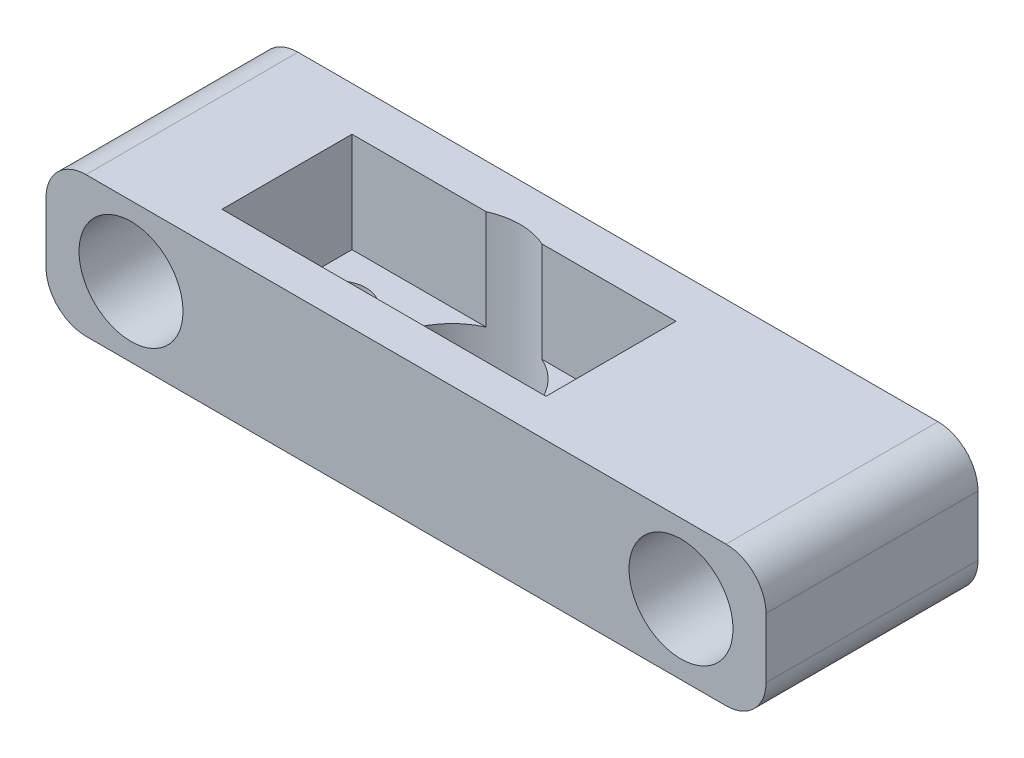
ISO-10303-21;
HEADER;
FILE_DESCRIPTION(('STEP AP214'),'2;1');
FILE_NAME('part.step','',(''),(''),'','','');
FILE_SCHEMA(('AUTOMOTIVE_DESIGN { 1 0 10303 214 1 1 1 1 }'));
ENDSEC;
DATA;
#1=APPLICATION_CONTEXT('core data for automotive mechanical design processes');
#2=APPLICATION_PROTOCOL_DEFINITION('international standard','automotive_design',2000,#1);
#3=PRODUCT_CONTEXT('',#1,'mechanical');
#4=PRODUCT('Part','Part','',(#3));
#5=PRODUCT_RELATED_PRODUCT_CATEGORY('part','',(#4));
#6=PRODUCT_DEFINITION_FORMATION('','',#4);
#7=PRODUCT_DEFINITION_CONTEXT('part definition',#1,'design');
#8=PRODUCT_DEFINITION('design','',#6,#7);
#9=PRODUCT_DEFINITION_SHAPE('','',#8);
#10=(LENGTH_UNIT() NAMED_UNIT(*) SI_UNIT(.MILLI.,.METRE.));
#11=(NAMED_UNIT(*) PLANE_ANGLE_UNIT() SI_UNIT($,.RADIAN.));
#12=(NAMED_UNIT(*) SI_UNIT($,.STERADIAN.) SOLID_ANGLE_UNIT());
#13=UNCERTAINTY_MEASURE_WITH_UNIT(LENGTH_MEASURE(1.E-05),#10,'distance_accuracy_value','');
#14=(GEOMETRIC_REPRESENTATION_CONTEXT(3) GLOBAL_UNCERTAINTY_ASSIGNED_CONTEXT((#13)) GLOBAL_UNIT_ASSIGNED_CONTEXT((#10,
#11,#12)) REPRESENTATION_CONTEXT('',''));
#15=CARTESIAN_POINT('',(0.,0.,0.));
#16=DIRECTION('',(0.,0.,1.));
#17=DIRECTION('',(1.,0.,0.));
#18=AXIS2_PLACEMENT_3D('',#15,#16,#17);
#19=CARTESIAN_POINT('',(0.,0.,10.6));
#20=DIRECTION('',(0.,0.,1.));
#21=DIRECTION('',(1.,0.,0.));
#22=AXIS2_PLACEMENT_3D('',#19,#20,#21);
#23=PLANE('',#22);
#24=CARTESIAN_POINT('',(-41.766694490818,12.3780487804878,10.6));
#25=DIRECTION('',(0.,0.,1.));
#26=DIRECTION('',(1.,0.,0.));
#27=AXIS2_PLACEMENT_3D('',#24,#25,#26);
#28=CIRCLE('',#27,2.6);
#29=CARTESIAN_POINT('',(-39.166694490818,12.3780487804878,10.6));
#30=VERTEX_POINT('',#29);
#31=EDGE_CURVE('E212',#30,#30,#28,.T.);
#32=ORIENTED_EDGE('',*,*,#31,.F.);
#33=EDGE_LOOP('',(#32));
#34=FACE_BOUND('',#33,.T.);
#35=DIRECTION('',(0.,1.,0.));
#36=VECTOR('',#35,1.);
#37=CARTESIAN_POINT('',(-10.016694490818,15.8780487804878,10.6));
#38=LINE('',#37,#36);
#39=CARTESIAN_POINT('',(-10.016694490818,10.8780487804878,10.6));
#40=VERTEX_POINT('',#39);
#41=CARTESIAN_POINT('',(-10.016694490818,13.8780487804878,10.6));
#42=VERTEX_POINT('',#41);
#43=EDGE_CURVE('E223',#40,#42,#38,.T.);
#44=ORIENTED_EDGE('',*,*,#43,.T.);
#45=CARTESIAN_POINT('',(-12.016694490818,13.8780487804878,10.6));
#46=DIRECTION('',(0.,0.,1.));
#47=DIRECTION('',(1.,0.,0.));
#48=AXIS2_PLACEMENT_3D('',#45,#46,#47);
#49=CIRCLE('',#48,2.);
#50=CARTESIAN_POINT('',(-12.016694490818,15.8780487804878,10.6));
#51=VERTEX_POINT('',#50);
#52=EDGE_CURVE('E261',#42,#51,#49,.T.);
#53=ORIENTED_EDGE('',*,*,#52,.T.);
#54=DIRECTION('',(-1.,0.,0.));
#55=VECTOR('',#54,1.);
#56=CARTESIAN_POINT('',(-46.016694490818,15.8780487804878,10.6));
#57=LINE('',#56,#55);
#58=CARTESIAN_POINT('',(-44.016694490818,15.8780487804878,10.6));
#59=VERTEX_POINT('',#58);
#60=EDGE_CURVE('E226',#51,#59,#57,.T.);
#61=ORIENTED_EDGE('',*,*,#60,.T.);
#62=CARTESIAN_POINT('',(-44.016694490818,13.8780487804878,10.6));
#63=DIRECTION('',(0.,0.,1.));
#64=DIRECTION('',(1.,0.,0.));
#65=AXIS2_PLACEMENT_3D('',#62,#63,#64);
#66=CIRCLE('',#65,2.);
#67=CARTESIAN_POINT('',(-46.016694490818,13.8780487804878,10.6));
#68=VERTEX_POINT('',#67);
#69=EDGE_CURVE('E256',#59,#68,#66,.T.);
#70=ORIENTED_EDGE('',*,*,#69,.T.);
#71=DIRECTION('',(0.,-1.,0.));
#72=VECTOR('',#71,1.);
#73=CARTESIAN_POINT('',(-46.016694490818,15.8780487804878,10.6));
#74=LINE('',#73,#72);
#75=CARTESIAN_POINT('',(-46.016694490818,10.8780487804878,10.6));
#76=VERTEX_POINT('',#75);
#77=EDGE_CURVE('E218',#68,#76,#74,.T.);
#78=ORIENTED_EDGE('',*,*,#77,.T.);
#79=CARTESIAN_POINT('',(-44.016694490818,10.8780487804878,10.6));
#80=DIRECTION('',(0.,0.,1.));
#81=DIRECTION('',(1.,0.,0.));
#82=AXIS2_PLACEMENT_3D('',#79,#80,#81);
#83=CIRCLE('',#82,2.);
#84=CARTESIAN_POINT('',(-44.016694490818,8.8780487804878,10.6));
#85=VERTEX_POINT('',#84);
#86=EDGE_CURVE('E55',#76,#85,#83,.T.);
#87=ORIENTED_EDGE('',*,*,#86,.T.);
#88=DIRECTION('',(1.,0.,0.));
#89=VECTOR('',#88,1.);
#90=CARTESIAN_POINT('',(-46.016694490818,8.8780487804878,10.6));
#91=LINE('',#90,#89);
#92=CARTESIAN_POINT('',(-12.016694490818,8.8780487804878,10.6));
#93=VERTEX_POINT('',#92);
#94=EDGE_CURVE('E220',#85,#93,#91,.T.);
#95=ORIENTED_EDGE('',*,*,#94,.T.);
#96=CARTESIAN_POINT('',(-12.016694490818,10.8780487804878,10.6));
#97=DIRECTION('',(0.,0.,1.));
#98=DIRECTION('',(1.,0.,0.));
#99=AXIS2_PLACEMENT_3D('',#96,#97,#98);
#100=CIRCLE('',#99,2.);
#101=EDGE_CURVE('E259',#93,#40,#100,.T.);
#102=ORIENTED_EDGE('',*,*,#101,.T.);
#103=EDGE_LOOP('',(#44,#53,#61,#70,#78,#87,#95,#102));
#104=FACE_BOUND('',#103,.T.);
#105=CARTESIAN_POINT('',(-14.266694490818,12.3780487804878,10.6));
#106=DIRECTION('',(0.,0.,1.));
#107=DIRECTION('',(1.,0.,0.));
#108=AXIS2_PLACEMENT_3D('',#105,#106,#107);
#109=CIRCLE('',#108,2.6);
#110=CARTESIAN_POINT('',(-11.666694490818,12.3780487804878,10.6));
#111=VERTEX_POINT('',#110);
#112=EDGE_CURVE('E206',#111,#111,#109,.T.);
#113=ORIENTED_EDGE('',*,*,#112,.F.);
#114=EDGE_LOOP('',(#113));
#115=FACE_BOUND('',#114,.T.);
#116=ADVANCED_FACE('F33',(#34,#104,#115),#23,.T.);
#117=CARTESIAN_POINT('',(0.,0.,0.));
#118=DIRECTION('',(0.,0.,1.));
#119=DIRECTION('',(1.,0.,0.));
#120=AXIS2_PLACEMENT_3D('',#117,#118,#119);
#121=PLANE('',#120);
#122=DIRECTION('',(-1.,0.,0.));
#123=VECTOR('',#122,1.);
#124=CARTESIAN_POINT('',(-46.016694490818,15.8780487804878,0.));
#125=LINE('',#124,#123);
#126=CARTESIAN_POINT('',(-12.016694490818,15.8780487804878,0.));
#127=VERTEX_POINT('',#126);
#128=CARTESIAN_POINT('',(-44.016694490818,15.8780487804878,0.));
#129=VERTEX_POINT('',#128);
#130=EDGE_CURVE('E221',#127,#129,#125,.T.);
#131=ORIENTED_EDGE('',*,*,#130,.F.);
#132=CARTESIAN_POINT('',(-12.016694490818,13.8780487804878,0.));
#133=DIRECTION('',(0.,0.,1.));
#134=DIRECTION('',(1.,0.,0.));
#135=AXIS2_PLACEMENT_3D('',#132,#133,#134);
#136=CIRCLE('',#135,2.);
#137=CARTESIAN_POINT('',(-10.016694490818,13.8780487804878,0.));
#138=VERTEX_POINT('',#137);
#139=EDGE_CURVE('E249',#127,#138,#136,.F.);
#140=ORIENTED_EDGE('',*,*,#139,.T.);
#141=DIRECTION('',(0.,1.,0.));
#142=VECTOR('',#141,1.);
#143=CARTESIAN_POINT('',(-10.016694490818,15.8780487804878,0.));
#144=LINE('',#143,#142);
#145=CARTESIAN_POINT('',(-10.016694490818,10.8780487804878,0.));
#146=VERTEX_POINT('',#145);
#147=EDGE_CURVE('E234',#146,#138,#144,.T.);
#148=ORIENTED_EDGE('',*,*,#147,.F.);
#149=CARTESIAN_POINT('',(-12.016694490818,10.8780487804878,0.));
#150=DIRECTION('',(0.,0.,1.));
#151=DIRECTION('',(1.,0.,0.));
#152=AXIS2_PLACEMENT_3D('',#149,#150,#151);
#153=CIRCLE('',#152,2.);
#154=CARTESIAN_POINT('',(-12.016694490818,8.8780487804878,0.));
#155=VERTEX_POINT('',#154);
#156=EDGE_CURVE('E247',#146,#155,#153,.F.);
#157=ORIENTED_EDGE('',*,*,#156,.T.);
#158=DIRECTION('',(1.,0.,0.));
#159=VECTOR('',#158,1.);
#160=CARTESIAN_POINT('',(-46.016694490818,8.8780487804878,0.));
#161=LINE('',#160,#159);
#162=CARTESIAN_POINT('',(-44.016694490818,8.8780487804878,0.));
#163=VERTEX_POINT('',#162);
#164=EDGE_CURVE('E232',#163,#155,#161,.T.);
#165=ORIENTED_EDGE('',*,*,#164,.F.);
#166=CARTESIAN_POINT('',(-44.016694490818,10.8780487804878,0.));
#167=DIRECTION('',(0.,0.,1.));
#168=DIRECTION('',(1.,0.,0.));
#169=AXIS2_PLACEMENT_3D('',#166,#167,#168);
#170=CIRCLE('',#169,2.);
#171=CARTESIAN_POINT('',(-46.016694490818,10.8780487804878,0.));
#172=VERTEX_POINT('',#171);
#173=EDGE_CURVE('E245',#163,#172,#170,.F.);
#174=ORIENTED_EDGE('',*,*,#173,.T.);
#175=DIRECTION('',(0.,-1.,0.));
#176=VECTOR('',#175,1.);
#177=CARTESIAN_POINT('',(-46.016694490818,15.8780487804878,0.));
#178=LINE('',#177,#176);
#179=CARTESIAN_POINT('',(-46.016694490818,13.8780487804878,0.));
#180=VERTEX_POINT('',#179);
#181=EDGE_CURVE('E215',#180,#172,#178,.T.);
#182=ORIENTED_EDGE('',*,*,#181,.F.);
#183=CARTESIAN_POINT('',(-44.016694490818,13.8780487804878,0.));
#184=DIRECTION('',(0.,0.,1.));
#185=DIRECTION('',(1.,0.,0.));
#186=AXIS2_PLACEMENT_3D('',#183,#184,#185);
#187=CIRCLE('',#186,2.);
#188=EDGE_CURVE('E243',#180,#129,#187,.F.);
#189=ORIENTED_EDGE('',*,*,#188,.T.);
#190=EDGE_LOOP('',(#131,#140,#148,#157,#165,#174,#182,#189));
#191=FACE_BOUND('',#190,.T.);
#192=CARTESIAN_POINT('',(-41.766694490818,12.3780487804878,0.));
#193=DIRECTION('',(0.,0.,1.));
#194=DIRECTION('',(1.,0.,0.));
#195=AXIS2_PLACEMENT_3D('',#192,#193,#194);
#196=CIRCLE('',#195,2.6);
#197=CARTESIAN_POINT('',(-39.166694490818,12.3780487804878,0.));
#198=VERTEX_POINT('',#197);
#199=EDGE_CURVE('E209',#198,#198,#196,.T.);
#200=ORIENTED_EDGE('',*,*,#199,.T.);
#201=EDGE_LOOP('',(#200));
#202=FACE_BOUND('',#201,.T.);
#203=CARTESIAN_POINT('',(-14.266694490818,12.3780487804878,0.));
#204=DIRECTION('',(0.,0.,1.));
#205=DIRECTION('',(1.,0.,0.));
#206=AXIS2_PLACEMENT_3D('',#203,#204,#205);
#207=CIRCLE('',#206,2.6);
#208=CARTESIAN_POINT('',(-11.666694490818,12.3780487804878,0.));
#209=VERTEX_POINT('',#208);
#210=EDGE_CURVE('E203',#209,#209,#207,.T.);
#211=ORIENTED_EDGE('',*,*,#210,.T.);
#212=EDGE_LOOP('',(#211));
#213=FACE_BOUND('',#212,.T.);
#214=ADVANCED_FACE('F310',(#191,#202,#213),#121,.F.);
#215=CARTESIAN_POINT('',(-46.016694490818,15.8780487804878,10.6));
#216=DIRECTION('',(1.,0.,0.));
#217=DIRECTION('',(0.,0.,-1.));
#218=AXIS2_PLACEMENT_3D('',#215,#216,#217);
#219=PLANE('',#218);
#220=ORIENTED_EDGE('',*,*,#181,.T.);
#221=DIRECTION('',(0.,0.,-1.));
#222=VECTOR('',#221,1.);
#223=CARTESIAN_POINT('',(-46.016694490818,10.8780487804878,10.6));
#224=LINE('',#223,#222);
#225=EDGE_CURVE('E270',#172,#76,#224,.F.);
#226=ORIENTED_EDGE('',*,*,#225,.T.);
#227=ORIENTED_EDGE('',*,*,#77,.F.);
#228=DIRECTION('',(0.,0.,-1.));
#229=VECTOR('',#228,1.);
#230=CARTESIAN_POINT('',(-46.016694490818,13.8780487804878,10.6));
#231=LINE('',#230,#229);
#232=EDGE_CURVE('E267',#68,#180,#231,.T.);
#233=ORIENTED_EDGE('',*,*,#232,.T.);
#234=EDGE_LOOP('',(#220,#226,#227,#233));
#235=FACE_BOUND('',#234,.T.);
#236=ADVANCED_FACE('F316',(#235),#219,.F.);
#237=CARTESIAN_POINT('',(-46.016694490818,8.8780487804878,10.6));
#238=DIRECTION('',(0.,1.,0.));
#239=DIRECTION('',(0.,0.,1.));
#240=AXIS2_PLACEMENT_3D('',#237,#238,#239);
#241=PLANE('',#240);
#242=CARTESIAN_POINT('',(-24.916694490818,8.8780487804878,5.));
#243=DIRECTION('',(0.,1.,0.));
#244=DIRECTION('',(0.,0.,1.));
#245=AXIS2_PLACEMENT_3D('',#242,#243,#244);
#246=CIRCLE('',#245,1.5);
#247=CARTESIAN_POINT('',(-24.916694490818,8.8780487804878,6.5));
#248=VERTEX_POINT('',#247);
#249=EDGE_CURVE('E175',#248,#248,#246,.T.);
#250=ORIENTED_EDGE('',*,*,#249,.T.);
#251=EDGE_LOOP('',(#250));
#252=FACE_BOUND('',#251,.T.);
#253=CARTESIAN_POINT('',(-37.116694490818,8.8780487804878,5.));
#254=DIRECTION('',(0.,1.,0.));
#255=DIRECTION('',(0.,0.,1.));
#256=AXIS2_PLACEMENT_3D('',#253,#254,#255);
#257=CIRCLE('',#256,1.5);
#258=CARTESIAN_POINT('',(-37.116694490818,8.8780487804878,6.5));
#259=VERTEX_POINT('',#258);
#260=EDGE_CURVE('E182',#259,#259,#257,.T.);
#261=ORIENTED_EDGE('',*,*,#260,.T.);
#262=EDGE_LOOP('',(#261));
#263=FACE_BOUND('',#262,.T.);
#264=CARTESIAN_POINT('',(-31.016694490818,8.8780487804878,5.3));
#265=DIRECTION('',(0.,-1.,0.));
#266=DIRECTION('',(0.,0.,-1.));
#267=AXIS2_PLACEMENT_3D('',#264,#265,#266);
#268=CIRCLE('',#267,3.4);
#269=CARTESIAN_POINT('',(-31.016694490818,8.8780487804878,1.9));
#270=VERTEX_POINT('',#269);
#271=EDGE_CURVE('E197',#270,#270,#268,.T.);
#272=ORIENTED_EDGE('',*,*,#271,.F.);
#273=EDGE_LOOP('',(#272));
#274=FACE_BOUND('',#273,.T.);
#275=ORIENTED_EDGE('',*,*,#164,.T.);
#276=DIRECTION('',(0.,0.,-1.));
#277=VECTOR('',#276,1.);
#278=CARTESIAN_POINT('',(-12.016694490818,8.8780487804878,10.6));
#279=LINE('',#278,#277);
#280=EDGE_CURVE('E48',#155,#93,#279,.F.);
#281=ORIENTED_EDGE('',*,*,#280,.T.);
#282=ORIENTED_EDGE('',*,*,#94,.F.);
#283=DIRECTION('',(0.,0.,-1.));
#284=VECTOR('',#283,1.);
#285=CARTESIAN_POINT('',(-44.016694490818,8.8780487804878,10.6));
#286=LINE('',#285,#284);
#287=EDGE_CURVE('E263',#85,#163,#286,.T.);
#288=ORIENTED_EDGE('',*,*,#287,.T.);
#289=EDGE_LOOP('',(#275,#281,#282,#288));
#290=FACE_BOUND('',#289,.T.);
#291=ADVANCED_FACE('F329',(#252,#263,#274,#290),#241,.F.);
#292=CARTESIAN_POINT('',(-10.016694490818,15.8780487804878,10.6));
#293=DIRECTION('',(-1.,0.,0.));
#294=DIRECTION('',(0.,-1.,0.));
#295=AXIS2_PLACEMENT_3D('',#292,#293,#294);
#296=PLANE('',#295);
#297=ORIENTED_EDGE('',*,*,#147,.T.);
#298=DIRECTION('',(0.,0.,-1.));
#299=VECTOR('',#298,1.);
#300=CARTESIAN_POINT('',(-10.016694490818,13.8780487804878,10.6));
#301=LINE('',#300,#299);
#302=EDGE_CURVE('E254',#138,#42,#301,.F.);
#303=ORIENTED_EDGE('',*,*,#302,.T.);
#304=ORIENTED_EDGE('',*,*,#43,.F.);
#305=DIRECTION('',(0.,0.,-1.));
#306=VECTOR('',#305,1.);
#307=CARTESIAN_POINT('',(-10.016694490818,10.8780487804878,10.6));
#308=LINE('',#307,#306);
#309=EDGE_CURVE('E251',#40,#146,#308,.T.);
#310=ORIENTED_EDGE('',*,*,#309,.T.);
#311=EDGE_LOOP('',(#297,#303,#304,#310));
#312=FACE_BOUND('',#311,.T.);
#313=ADVANCED_FACE('F326',(#312),#296,.F.);
#314=CARTESIAN_POINT('',(-46.016694490818,15.8780487804878,10.6));
#315=DIRECTION('',(0.,-1.,0.));
#316=DIRECTION('',(0.,0.,-1.));
#317=AXIS2_PLACEMENT_3D('',#314,#315,#316);
#318=PLANE('',#317);
#319=DIRECTION('',(0.,0.,1.));
#320=VECTOR('',#319,1.);
#321=CARTESIAN_POINT('',(-39.116694490818,15.8780487804878,2.29999999999999));
#322=LINE('',#321,#320);
#323=CARTESIAN_POINT('',(-39.116694490818,15.8780487804878,2.2));
#324=VERTEX_POINT('',#323);
#325=CARTESIAN_POINT('',(-39.116694490818,15.8780487804878,8.69999999999999));
#326=VERTEX_POINT('',#325);
#327=EDGE_CURVE('E178',#324,#326,#322,.T.);
#328=ORIENTED_EDGE('',*,*,#327,.F.);
#329=DIRECTION('',(-1.,0.,0.));
#330=VECTOR('',#329,1.);
#331=CARTESIAN_POINT('',(-22.916694490818,15.8780487804878,2.19999999999999));
#332=LINE('',#331,#330);
#333=CARTESIAN_POINT('',(-32.4131184951949,15.8780487804878,2.2));
#334=VERTEX_POINT('',#333);
#335=EDGE_CURVE('E171',#334,#324,#332,.T.);
#336=ORIENTED_EDGE('',*,*,#335,.F.);
#337=CARTESIAN_POINT('',(-31.016694490818,15.8780487804878,5.3));
#338=DIRECTION('',(0.,-1.,0.));
#339=DIRECTION('',(0.,0.,-1.));
#340=AXIS2_PLACEMENT_3D('',#337,#338,#339);
#341=CIRCLE('',#340,3.4);
#342=CARTESIAN_POINT('',(-29.6202704864411,15.8780487804878,2.2));
#343=VERTEX_POINT('',#342);
#344=EDGE_CURVE('E200',#334,#343,#341,.T.);
#345=ORIENTED_EDGE('',*,*,#344,.T.);
#346=CARTESIAN_POINT('',(-22.916694490818,15.8780487804878,2.19999999999999));
#347=VERTEX_POINT('',#346);
#348=EDGE_CURVE('E168',#347,#343,#332,.T.);
#349=ORIENTED_EDGE('',*,*,#348,.F.);
#350=DIRECTION('',(0.,0.,-1.));
#351=VECTOR('',#350,1.);
#352=CARTESIAN_POINT('',(-22.916694490818,15.8780487804878,8.69999999999999));
#353=LINE('',#352,#351);
#354=CARTESIAN_POINT('',(-22.916694490818,15.8780487804878,8.69999999999999));
#355=VERTEX_POINT('',#354);
#356=EDGE_CURVE('E157',#355,#347,#353,.T.);
#357=ORIENTED_EDGE('',*,*,#356,.F.);
#358=DIRECTION('',(1.,0.,0.));
#359=VECTOR('',#358,1.);
#360=CARTESIAN_POINT('',(-39.116694490818,15.8780487804878,8.69999999999999));
#361=LINE('',#360,#359);
#362=EDGE_CURVE('E192',#326,#355,#361,.T.);
#363=ORIENTED_EDGE('',*,*,#362,.F.);
#364=EDGE_LOOP('',(#328,#336,#345,#349,#357,#363));
#365=FACE_BOUND('',#364,.T.);
#366=ORIENTED_EDGE('',*,*,#60,.F.);
#367=DIRECTION('',(0.,0.,-1.));
#368=VECTOR('',#367,1.);
#369=CARTESIAN_POINT('',(-12.016694490818,15.8780487804878,10.6));
#370=LINE('',#369,#368);
#371=EDGE_CURVE('E240',#51,#127,#370,.T.);
#372=ORIENTED_EDGE('',*,*,#371,.T.);
#373=ORIENTED_EDGE('',*,*,#130,.T.);
#374=DIRECTION('',(0.,0.,-1.));
#375=VECTOR('',#374,1.);
#376=CARTESIAN_POINT('',(-44.016694490818,15.8780487804878,10.6));
#377=LINE('',#376,#375);
#378=EDGE_CURVE('E229',#129,#59,#377,.F.);
#379=ORIENTED_EDGE('',*,*,#378,.T.);
#380=EDGE_LOOP('',(#366,#372,#373,#379));
#381=FACE_BOUND('',#380,.T.);
#382=ADVANCED_FACE('F290',(#365,#381),#318,.F.);
#383=CARTESIAN_POINT('',(-41.766694490818,12.3780487804878,10.6));
#384=DIRECTION('',(0.,0.,-1.));
#385=DIRECTION('',(-1.,0.,0.));
#386=AXIS2_PLACEMENT_3D('',#383,#384,#385);
#387=CYLINDRICAL_SURFACE('',#386,2.6);
#388=ORIENTED_EDGE('',*,*,#31,.T.);
#389=EDGE_LOOP('',(#388));
#390=FACE_BOUND('',#389,.T.);
#391=ORIENTED_EDGE('',*,*,#199,.F.);
#392=EDGE_LOOP('',(#391));
#393=FACE_BOUND('',#392,.T.);
#394=ADVANCED_FACE('F321',(#390,#393),#387,.F.);
#395=CARTESIAN_POINT('',(-14.266694490818,12.3780487804878,10.6));
#396=DIRECTION('',(0.,0.,-1.));
#397=DIRECTION('',(-1.,0.,0.));
#398=AXIS2_PLACEMENT_3D('',#395,#396,#397);
#399=CYLINDRICAL_SURFACE('',#398,2.6);
#400=ORIENTED_EDGE('',*,*,#112,.T.);
#401=EDGE_LOOP('',(#400));
#402=FACE_BOUND('',#401,.T.);
#403=ORIENTED_EDGE('',*,*,#210,.F.);
#404=EDGE_LOOP('',(#403));
#405=FACE_BOUND('',#404,.T.);
#406=ADVANCED_FACE('F369',(#402,#405),#399,.F.);
#407=CARTESIAN_POINT('',(-31.016694490818,15.8780487804878,5.3));
#408=DIRECTION('',(0.,-1.,0.));
#409=DIRECTION('',(0.,0.,-1.));
#410=AXIS2_PLACEMENT_3D('',#407,#408,#409);
#411=CYLINDRICAL_SURFACE('',#410,3.4);
#412=ORIENTED_EDGE('',*,*,#344,.F.);
#413=DIRECTION('',(0.,-1.,0.));
#414=VECTOR('',#413,1.);
#415=CARTESIAN_POINT('',(-32.4131184951949,15.8780487804878,2.2));
#416=LINE('',#415,#414);
#417=CARTESIAN_POINT('',(-32.4131184951949,10.8780487804878,2.2));
#418=VERTEX_POINT('',#417);
#419=EDGE_CURVE('E11',#334,#418,#416,.T.);
#420=ORIENTED_EDGE('',*,*,#419,.T.);
#421=CARTESIAN_POINT('',(-31.016694490818,10.8780487804878,5.3));
#422=DIRECTION('',(0.,1.,0.));
#423=DIRECTION('',(0.,0.,1.));
#424=AXIS2_PLACEMENT_3D('',#421,#422,#423);
#425=CIRCLE('',#424,3.4);
#426=CARTESIAN_POINT('',(-31.016694490818,10.8780487804878,8.69999999999999));
#427=VERTEX_POINT('',#426);
#428=EDGE_CURVE('E273',#427,#418,#425,.F.);
#429=ORIENTED_EDGE('',*,*,#428,.F.);
#430=CARTESIAN_POINT('',(-29.6202704864411,10.8780487804878,2.2));
#431=VERTEX_POINT('',#430);
#432=EDGE_CURVE('E272',#431,#427,#425,.F.);
#433=ORIENTED_EDGE('',*,*,#432,.F.);
#434=DIRECTION('',(0.,-1.,0.));
#435=VECTOR('',#434,1.);
#436=CARTESIAN_POINT('',(-29.6202704864411,15.8780487804878,2.2));
#437=LINE('',#436,#435);
#438=EDGE_CURVE('E41',#431,#343,#437,.F.);
#439=ORIENTED_EDGE('',*,*,#438,.T.);
#440=EDGE_LOOP('',(#412,#420,#429,#433,#439));
#441=FACE_BOUND('',#440,.T.);
#442=ORIENTED_EDGE('',*,*,#271,.T.);
#443=EDGE_LOOP('',(#442));
#444=FACE_BOUND('',#443,.T.);
#445=ADVANCED_FACE('F287',(#441,#444),#411,.F.);
#446=CARTESIAN_POINT('',(-12.016694490818,13.8780487804878,10.6));
#447=DIRECTION('',(0.,0.,-1.));
#448=DIRECTION('',(-1.,0.,0.));
#449=AXIS2_PLACEMENT_3D('',#446,#447,#448);
#450=CYLINDRICAL_SURFACE('',#449,2.);
#451=ORIENTED_EDGE('',*,*,#52,.F.);
#452=ORIENTED_EDGE('',*,*,#302,.F.);
#453=ORIENTED_EDGE('',*,*,#139,.F.);
#454=ORIENTED_EDGE('',*,*,#371,.F.);
#455=EDGE_LOOP('',(#451,#452,#453,#454));
#456=FACE_BOUND('',#455,.T.);
#457=ADVANCED_FACE('F337',(#456),#450,.T.);
#458=CARTESIAN_POINT('',(-12.016694490818,10.8780487804878,10.6));
#459=DIRECTION('',(0.,0.,-1.));
#460=DIRECTION('',(-1.,0.,0.));
#461=AXIS2_PLACEMENT_3D('',#458,#459,#460);
#462=CYLINDRICAL_SURFACE('',#461,2.);
#463=ORIENTED_EDGE('',*,*,#101,.F.);
#464=ORIENTED_EDGE('',*,*,#280,.F.);
#465=ORIENTED_EDGE('',*,*,#156,.F.);
#466=ORIENTED_EDGE('',*,*,#309,.F.);
#467=EDGE_LOOP('',(#463,#464,#465,#466));
#468=FACE_BOUND('',#467,.T.);
#469=ADVANCED_FACE('F340',(#468),#462,.T.);
#470=CARTESIAN_POINT('',(-44.016694490818,10.8780487804878,10.6));
#471=DIRECTION('',(0.,0.,-1.));
#472=DIRECTION('',(-1.,0.,0.));
#473=AXIS2_PLACEMENT_3D('',#470,#471,#472);
#474=CYLINDRICAL_SURFACE('',#473,2.);
#475=ORIENTED_EDGE('',*,*,#86,.F.);
#476=ORIENTED_EDGE('',*,*,#225,.F.);
#477=ORIENTED_EDGE('',*,*,#173,.F.);
#478=ORIENTED_EDGE('',*,*,#287,.F.);
#479=EDGE_LOOP('',(#475,#476,#477,#478));
#480=FACE_BOUND('',#479,.T.);
#481=ADVANCED_FACE('F305',(#480),#474,.T.);
#482=CARTESIAN_POINT('',(-44.016694490818,13.8780487804878,10.6));
#483=DIRECTION('',(0.,0.,-1.));
#484=DIRECTION('',(-1.,0.,0.));
#485=AXIS2_PLACEMENT_3D('',#482,#483,#484);
#486=CYLINDRICAL_SURFACE('',#485,2.);
#487=ORIENTED_EDGE('',*,*,#69,.F.);
#488=ORIENTED_EDGE('',*,*,#378,.F.);
#489=ORIENTED_EDGE('',*,*,#188,.F.);
#490=ORIENTED_EDGE('',*,*,#232,.F.);
#491=EDGE_LOOP('',(#487,#488,#489,#490));
#492=FACE_BOUND('',#491,.T.);
#493=ADVANCED_FACE('F35',(#492),#486,.T.);
#494=CARTESIAN_POINT('',(-39.116694490818,10.8780487804878,8.69999999999999));
#495=DIRECTION('',(0.,0.,1.));
#496=DIRECTION('',(1.,0.,0.));
#497=AXIS2_PLACEMENT_3D('',#494,#495,#496);
#498=PLANE('',#497);
#499=DIRECTION('',(1.,0.,0.));
#500=VECTOR('',#499,1.);
#501=CARTESIAN_POINT('',(-39.116694490818,10.8780487804878,8.69999999999999));
#502=LINE('',#501,#500);
#503=CARTESIAN_POINT('',(-39.116694490818,10.8780487804878,8.69999999999999));
#504=VERTEX_POINT('',#503);
#505=EDGE_CURVE('E151',#504,#427,#502,.T.);
#506=ORIENTED_EDGE('',*,*,#505,.F.);
#507=DIRECTION('',(0.,1.,0.));
#508=VECTOR('',#507,1.);
#509=CARTESIAN_POINT('',(-39.116694490818,10.8780487804878,8.69999999999999));
#510=LINE('',#509,#508);
#511=EDGE_CURVE('E150',#504,#326,#510,.T.);
#512=ORIENTED_EDGE('',*,*,#511,.T.);
#513=ORIENTED_EDGE('',*,*,#362,.T.);
#514=DIRECTION('',(0.,1.,0.));
#515=VECTOR('',#514,1.);
#516=CARTESIAN_POINT('',(-22.916694490818,10.8780487804878,8.69999999999999));
#517=LINE('',#516,#515);
#518=CARTESIAN_POINT('',(-22.916694490818,10.8780487804878,8.69999999999999));
#519=VERTEX_POINT('',#518);
#520=EDGE_CURVE('E195',#519,#355,#517,.T.);
#521=ORIENTED_EDGE('',*,*,#520,.F.);
#522=EDGE_CURVE('E146',#427,#519,#502,.T.);
#523=ORIENTED_EDGE('',*,*,#522,.F.);
#524=EDGE_LOOP('',(#506,#512,#513,#521,#523));
#525=FACE_BOUND('',#524,.T.);
#526=ADVANCED_FACE('F297',(#525),#498,.F.);
#527=CARTESIAN_POINT('',(0.,10.8780487804878,0.));
#528=DIRECTION('',(0.,1.,0.));
#529=DIRECTION('',(0.,0.,1.));
#530=AXIS2_PLACEMENT_3D('',#527,#528,#529);
#531=PLANE('',#530);
#532=ORIENTED_EDGE('',*,*,#428,.T.);
#533=DIRECTION('',(-1.,0.,0.));
#534=VECTOR('',#533,1.);
#535=CARTESIAN_POINT('',(-22.916694490818,10.8780487804878,2.19999999999999));
#536=LINE('',#535,#534);
#537=CARTESIAN_POINT('',(-39.116694490818,10.8780487804878,2.2));
#538=VERTEX_POINT('',#537);
#539=EDGE_CURVE('E165',#418,#538,#536,.T.);
#540=ORIENTED_EDGE('',*,*,#539,.T.);
#541=DIRECTION('',(0.,0.,1.));
#542=VECTOR('',#541,1.);
#543=CARTESIAN_POINT('',(-39.116694490818,10.8780487804878,2.29999999999999));
#544=LINE('',#543,#542);
#545=EDGE_CURVE('E187',#538,#504,#544,.T.);
#546=ORIENTED_EDGE('',*,*,#545,.T.);
#547=ORIENTED_EDGE('',*,*,#505,.T.);
#548=EDGE_LOOP('',(#532,#540,#546,#547));
#549=FACE_BOUND('',#548,.T.);
#550=CARTESIAN_POINT('',(-37.116694490818,10.8780487804878,5.));
#551=DIRECTION('',(0.,1.,0.));
#552=DIRECTION('',(0.,0.,1.));
#553=AXIS2_PLACEMENT_3D('',#550,#551,#552);
#554=CIRCLE('',#553,1.5);
#555=CARTESIAN_POINT('',(-37.116694490818,10.8780487804878,6.5));
#556=VERTEX_POINT('',#555);
#557=EDGE_CURVE('E173',#556,#556,#554,.T.);
#558=ORIENTED_EDGE('',*,*,#557,.F.);
#559=EDGE_LOOP('',(#558));
#560=FACE_BOUND('',#559,.T.);
#561=ADVANCED_FACE('F279',(#549,#560),#531,.T.);
#562=DIRECTION('',(0.,0.,-1.));
#563=VECTOR('',#562,1.);
#564=CARTESIAN_POINT('',(-22.916694490818,10.8780487804878,8.69999999999999));
#565=LINE('',#564,#563);
#566=CARTESIAN_POINT('',(-22.916694490818,10.8780487804878,2.19999999999999));
#567=VERTEX_POINT('',#566);
#568=EDGE_CURVE('E139',#519,#567,#565,.T.);
#569=ORIENTED_EDGE('',*,*,#568,.T.);
#570=EDGE_CURVE('E144',#567,#431,#536,.T.);
#571=ORIENTED_EDGE('',*,*,#570,.T.);
#572=ORIENTED_EDGE('',*,*,#432,.T.);
#573=ORIENTED_EDGE('',*,*,#522,.T.);
#574=EDGE_LOOP('',(#569,#571,#572,#573));
#575=FACE_BOUND('',#574,.T.);
#576=CARTESIAN_POINT('',(-24.916694490818,10.8780487804878,5.));
#577=DIRECTION('',(0.,1.,0.));
#578=DIRECTION('',(0.,0.,1.));
#579=AXIS2_PLACEMENT_3D('',#576,#577,#578);
#580=CIRCLE('',#579,1.5);
#581=CARTESIAN_POINT('',(-24.916694490818,10.8780487804878,6.5));
#582=VERTEX_POINT('',#581);
#583=EDGE_CURVE('E179',#582,#582,#580,.T.);
#584=ORIENTED_EDGE('',*,*,#583,.F.);
#585=EDGE_LOOP('',(#584));
#586=FACE_BOUND('',#585,.T.);
#587=ADVANCED_FACE('F141',(#575,#586),#531,.T.);
#588=CARTESIAN_POINT('',(-22.916694490818,10.8780487804878,8.69999999999999));
#589=DIRECTION('',(1.,0.,0.));
#590=DIRECTION('',(0.,0.,-1.));
#591=AXIS2_PLACEMENT_3D('',#588,#589,#590);
#592=PLANE('',#591);
#593=ORIENTED_EDGE('',*,*,#356,.T.);
#594=DIRECTION('',(0.,1.,0.));
#595=VECTOR('',#594,1.);
#596=CARTESIAN_POINT('',(-22.916694490818,10.8780487804878,2.19999999999999));
#597=LINE('',#596,#595);
#598=EDGE_CURVE('E154',#567,#347,#597,.T.);
#599=ORIENTED_EDGE('',*,*,#598,.F.);
#600=ORIENTED_EDGE('',*,*,#568,.F.);
#601=ORIENTED_EDGE('',*,*,#520,.T.);
#602=EDGE_LOOP('',(#593,#599,#600,#601));
#603=FACE_BOUND('',#602,.T.);
#604=ADVANCED_FACE('F155',(#603),#592,.F.);
#605=CARTESIAN_POINT('',(-39.116694490818,10.8780487804878,2.29999999999999));
#606=DIRECTION('',(-1.,0.,0.));
#607=DIRECTION('',(0.,0.,1.));
#608=AXIS2_PLACEMENT_3D('',#605,#606,#607);
#609=PLANE('',#608);
#610=ORIENTED_EDGE('',*,*,#511,.F.);
#611=ORIENTED_EDGE('',*,*,#545,.F.);
#612=DIRECTION('',(0.,1.,0.));
#613=VECTOR('',#612,1.);
#614=CARTESIAN_POINT('',(-39.116694490818,10.8780487804878,2.2));
#615=LINE('',#614,#613);
#616=EDGE_CURVE('E160',#538,#324,#615,.T.);
#617=ORIENTED_EDGE('',*,*,#616,.T.);
#618=ORIENTED_EDGE('',*,*,#327,.T.);
#619=EDGE_LOOP('',(#610,#611,#617,#618));
#620=FACE_BOUND('',#619,.T.);
#621=ADVANCED_FACE('F295',(#620),#609,.F.);
#622=CARTESIAN_POINT('',(-24.916694490818,8.8780487804878,5.));
#623=DIRECTION('',(0.,1.,0.));
#624=DIRECTION('',(0.,0.,1.));
#625=AXIS2_PLACEMENT_3D('',#622,#623,#624);
#626=CYLINDRICAL_SURFACE('',#625,1.5);
#627=ORIENTED_EDGE('',*,*,#249,.F.);
#628=EDGE_LOOP('',(#627));
#629=FACE_BOUND('',#628,.T.);
#630=ORIENTED_EDGE('',*,*,#583,.T.);
#631=EDGE_LOOP('',(#630));
#632=FACE_BOUND('',#631,.T.);
#633=ADVANCED_FACE('F381',(#629,#632),#626,.F.);
#634=CARTESIAN_POINT('',(-37.116694490818,8.8780487804878,5.));
#635=DIRECTION('',(0.,1.,0.));
#636=DIRECTION('',(0.,0.,1.));
#637=AXIS2_PLACEMENT_3D('',#634,#635,#636);
#638=CYLINDRICAL_SURFACE('',#637,1.5);
#639=ORIENTED_EDGE('',*,*,#260,.F.);
#640=EDGE_LOOP('',(#639));
#641=FACE_BOUND('',#640,.T.);
#642=ORIENTED_EDGE('',*,*,#557,.T.);
#643=EDGE_LOOP('',(#642));
#644=FACE_BOUND('',#643,.T.);
#645=ADVANCED_FACE('F386',(#641,#644),#638,.F.);
#646=CARTESIAN_POINT('',(-22.916694490818,10.8780487804878,2.19999999999999));
#647=DIRECTION('',(0.,0.,-1.));
#648=DIRECTION('',(-1.,0.,0.));
#649=AXIS2_PLACEMENT_3D('',#646,#647,#648);
#650=PLANE('',#649);
#651=ORIENTED_EDGE('',*,*,#335,.T.);
#652=ORIENTED_EDGE('',*,*,#616,.F.);
#653=ORIENTED_EDGE('',*,*,#539,.F.);
#654=ORIENTED_EDGE('',*,*,#419,.F.);
#655=EDGE_LOOP('',(#651,#652,#653,#654));
#656=FACE_BOUND('',#655,.T.);
#657=ADVANCED_FACE('F285',(#656),#650,.F.);
#658=ORIENTED_EDGE('',*,*,#570,.F.);
#659=ORIENTED_EDGE('',*,*,#598,.T.);
#660=ORIENTED_EDGE('',*,*,#348,.T.);
#661=ORIENTED_EDGE('',*,*,#438,.F.);
#662=EDGE_LOOP('',(#658,#659,#660,#661));
#663=FACE_BOUND('',#662,.T.);
#664=ADVANCED_FACE('F163',(#663),#650,.F.);
#665=CLOSED_SHELL('',(#116,#214,#236,#291,#313,#382,#394,#406,#445,#457,#469,#481,#493,#526,
#561,#587,#604,#621,#633,#645,#657,#664));
#666=MANIFOLD_SOLID_BREP('B2',#665);
#667=ADVANCED_BREP_SHAPE_REPRESENTATION('',(#18,#666),#14);
#668=SHAPE_DEFINITION_REPRESENTATION(#9,#667);
ENDSEC;
END-ISO-10303-21;
